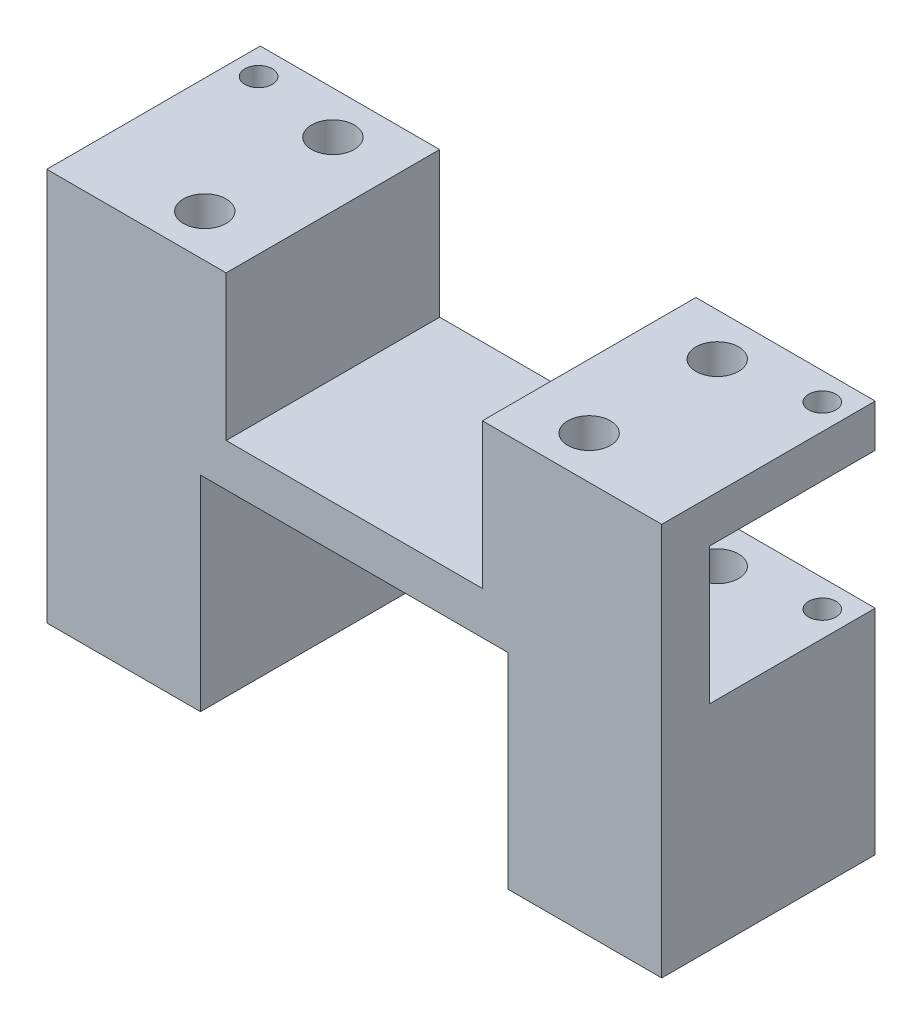
ISO-10303-21;
HEADER;
FILE_DESCRIPTION(('STEP AP214'),'2;1');
FILE_NAME('part.step','',(''),(''),'','','');
FILE_SCHEMA(('AUTOMOTIVE_DESIGN { 1 0 10303 214 1 1 1 1 }'));
ENDSEC;
DATA;
#1=APPLICATION_CONTEXT('core data for automotive mechanical design processes');
#2=APPLICATION_PROTOCOL_DEFINITION('international standard','automotive_design',2000,#1);
#3=PRODUCT_CONTEXT('',#1,'mechanical');
#4=PRODUCT('Part','Part','',(#3));
#5=PRODUCT_RELATED_PRODUCT_CATEGORY('part','',(#4));
#6=PRODUCT_DEFINITION_FORMATION('','',#4);
#7=PRODUCT_DEFINITION_CONTEXT('part definition',#1,'design');
#8=PRODUCT_DEFINITION('design','',#6,#7);
#9=PRODUCT_DEFINITION_SHAPE('','',#8);
#10=(LENGTH_UNIT() NAMED_UNIT(*) SI_UNIT(.MILLI.,.METRE.));
#11=(NAMED_UNIT(*) PLANE_ANGLE_UNIT() SI_UNIT($,.RADIAN.));
#12=(NAMED_UNIT(*) SI_UNIT($,.STERADIAN.) SOLID_ANGLE_UNIT());
#13=UNCERTAINTY_MEASURE_WITH_UNIT(LENGTH_MEASURE(1.E-05),#10,'distance_accuracy_value','');
#14=(GEOMETRIC_REPRESENTATION_CONTEXT(3) GLOBAL_UNCERTAINTY_ASSIGNED_CONTEXT((#13)) GLOBAL_UNIT_ASSIGNED_CONTEXT((#10,
#11,#12)) REPRESENTATION_CONTEXT('',''));
#15=CARTESIAN_POINT('',(0.,0.,0.));
#16=DIRECTION('',(0.,0.,1.));
#17=DIRECTION('',(1.,0.,0.));
#18=AXIS2_PLACEMENT_3D('',#15,#16,#17);
#19=CARTESIAN_POINT('',(22.4999999999999,46.,-7.5));
#20=DIRECTION('',(0.,1.,0.));
#21=DIRECTION('',(0.,0.,1.));
#22=AXIS2_PLACEMENT_3D('',#19,#20,#21);
#23=CYLINDRICAL_SURFACE('',#22,2.49999999999999);
#24=CARTESIAN_POINT('',(22.4999999999999,0.,-7.5));
#25=DIRECTION('',(0.,1.,0.));
#26=DIRECTION('',(0.,0.,1.));
#27=AXIS2_PLACEMENT_3D('',#24,#25,#26);
#28=CIRCLE('',#27,2.49999999999999);
#29=CARTESIAN_POINT('',(22.4999999999999,0.,-5.00000000000001));
#30=VERTEX_POINT('',#29);
#31=EDGE_CURVE('E289',#30,#30,#28,.T.);
#32=ORIENTED_EDGE('',*,*,#31,.F.);
#33=EDGE_LOOP('',(#32));
#34=FACE_BOUND('',#33,.T.);
#35=CARTESIAN_POINT('',(22.4999999999999,25.,-7.5));
#36=DIRECTION('',(0.,1.,0.));
#37=DIRECTION('',(0.,0.,1.));
#38=AXIS2_PLACEMENT_3D('',#35,#36,#37);
#39=CIRCLE('',#38,2.49999999999999);
#40=CARTESIAN_POINT('',(22.4999999999999,25.,-5.00000000000001));
#41=VERTEX_POINT('',#40);
#42=EDGE_CURVE('E347',#41,#41,#39,.F.);
#43=ORIENTED_EDGE('',*,*,#42,.F.);
#44=EDGE_LOOP('',(#43));
#45=FACE_BOUND('',#44,.T.);
#46=ADVANCED_FACE('F35',(#34,#45),#23,.F.);
#47=CARTESIAN_POINT('',(-22.5,46.,-7.49999999999999));
#48=DIRECTION('',(0.,1.,0.));
#49=DIRECTION('',(0.,0.,1.));
#50=AXIS2_PLACEMENT_3D('',#47,#48,#49);
#51=CYLINDRICAL_SURFACE('',#50,2.49999999999999);
#52=CARTESIAN_POINT('',(-22.5,0.,-7.49999999999999));
#53=DIRECTION('',(0.,1.,0.));
#54=DIRECTION('',(0.,0.,1.));
#55=AXIS2_PLACEMENT_3D('',#52,#53,#54);
#56=CIRCLE('',#55,2.49999999999999);
#57=CARTESIAN_POINT('',(-22.5,0.,-5.00000000000001));
#58=VERTEX_POINT('',#57);
#59=EDGE_CURVE('E283',#58,#58,#56,.T.);
#60=ORIENTED_EDGE('',*,*,#59,.F.);
#61=EDGE_LOOP('',(#60));
#62=FACE_BOUND('',#61,.T.);
#63=CARTESIAN_POINT('',(-22.5,25.,-7.49999999999999));
#64=DIRECTION('',(0.,1.,0.));
#65=DIRECTION('',(0.,0.,1.));
#66=AXIS2_PLACEMENT_3D('',#63,#64,#65);
#67=CIRCLE('',#66,2.49999999999999);
#68=CARTESIAN_POINT('',(-22.5,25.,-5.));
#69=VERTEX_POINT('',#68);
#70=EDGE_CURVE('E196',#69,#69,#67,.F.);
#71=ORIENTED_EDGE('',*,*,#70,.F.);
#72=EDGE_LOOP('',(#71));
#73=FACE_BOUND('',#72,.T.);
#74=ADVANCED_FACE('F374',(#62,#73),#51,.F.);
#75=CARTESIAN_POINT('',(0.,46.,0.));
#76=DIRECTION('',(0.,1.,0.));
#77=DIRECTION('',(0.,0.,1.));
#78=AXIS2_PLACEMENT_3D('',#75,#76,#77);
#79=PLANE('',#78);
#80=DIRECTION('',(0.,0.,1.));
#81=VECTOR('',#80,1.);
#82=CARTESIAN_POINT('',(-15.,46.,12.5));
#83=LINE('',#82,#81);
#84=CARTESIAN_POINT('',(-15.,46.,-12.5));
#85=VERTEX_POINT('',#84);
#86=CARTESIAN_POINT('',(-15.,46.,12.5));
#87=VERTEX_POINT('',#86);
#88=EDGE_CURVE('E216',#85,#87,#83,.T.);
#89=ORIENTED_EDGE('',*,*,#88,.F.);
#90=DIRECTION('',(-1.,0.,0.));
#91=VECTOR('',#90,1.);
#92=CARTESIAN_POINT('',(-36.,46.,-12.5));
#93=LINE('',#92,#91);
#94=CARTESIAN_POINT('',(-36.,46.,-12.5));
#95=VERTEX_POINT('',#94);
#96=EDGE_CURVE('E308',#85,#95,#93,.T.);
#97=ORIENTED_EDGE('',*,*,#96,.T.);
#98=DIRECTION('',(0.,0.,1.));
#99=VECTOR('',#98,1.);
#100=CARTESIAN_POINT('',(-36.,46.,-12.5));
#101=LINE('',#100,#99);
#102=CARTESIAN_POINT('',(-36.,46.,12.5));
#103=VERTEX_POINT('',#102);
#104=EDGE_CURVE('E313',#95,#103,#101,.T.);
#105=ORIENTED_EDGE('',*,*,#104,.T.);
#106=DIRECTION('',(1.,0.,0.));
#107=VECTOR('',#106,1.);
#108=CARTESIAN_POINT('',(-36.,46.,12.5));
#109=LINE('',#108,#107);
#110=EDGE_CURVE('E316',#103,#87,#109,.T.);
#111=ORIENTED_EDGE('',*,*,#110,.T.);
#112=EDGE_LOOP('',(#89,#97,#105,#111));
#113=FACE_BOUND('',#112,.T.);
#114=CARTESIAN_POINT('',(-33.,46.,-9.30000000000001));
#115=DIRECTION('',(0.,1.,0.));
#116=DIRECTION('',(0.,0.,1.));
#117=AXIS2_PLACEMENT_3D('',#114,#115,#116);
#118=CIRCLE('',#117,1.6);
#119=CARTESIAN_POINT('',(-33.,46.,-7.70000000000001));
#120=VERTEX_POINT('',#119);
#121=EDGE_CURVE('E296',#120,#120,#118,.T.);
#122=ORIENTED_EDGE('',*,*,#121,.F.);
#123=EDGE_LOOP('',(#122));
#124=FACE_BOUND('',#123,.T.);
#125=CARTESIAN_POINT('',(-22.5,46.,-7.49999999999999));
#126=DIRECTION('',(0.,1.,0.));
#127=DIRECTION('',(0.,0.,1.));
#128=AXIS2_PLACEMENT_3D('',#125,#126,#127);
#129=CIRCLE('',#128,2.5);
#130=CARTESIAN_POINT('',(-22.5,46.,-5.));
#131=VERTEX_POINT('',#130);
#132=EDGE_CURVE('E280',#131,#131,#129,.T.);
#133=ORIENTED_EDGE('',*,*,#132,.F.);
#134=EDGE_LOOP('',(#133));
#135=FACE_BOUND('',#134,.T.);
#136=CARTESIAN_POINT('',(-22.5,46.,7.50000000000001));
#137=DIRECTION('',(0.,1.,0.));
#138=DIRECTION('',(0.,0.,1.));
#139=AXIS2_PLACEMENT_3D('',#136,#137,#138);
#140=CIRCLE('',#139,2.5);
#141=CARTESIAN_POINT('',(-22.5,46.,10.));
#142=VERTEX_POINT('',#141);
#143=EDGE_CURVE('E262',#142,#142,#140,.T.);
#144=ORIENTED_EDGE('',*,*,#143,.F.);
#145=EDGE_LOOP('',(#144));
#146=FACE_BOUND('',#145,.T.);
#147=ADVANCED_FACE('F380',(#113,#124,#135,#146),#79,.T.);
#148=CARTESIAN_POINT('',(0.,0.,0.));
#149=DIRECTION('',(0.,1.,0.));
#150=DIRECTION('',(0.,0.,1.));
#151=AXIS2_PLACEMENT_3D('',#148,#149,#150);
#152=PLANE('',#151);
#153=ORIENTED_EDGE('',*,*,#31,.T.);
#154=EDGE_LOOP('',(#153));
#155=FACE_BOUND('',#154,.T.);
#156=CARTESIAN_POINT('',(22.5,0.,7.5));
#157=DIRECTION('',(0.,1.,0.));
#158=DIRECTION('',(0.,0.,1.));
#159=AXIS2_PLACEMENT_3D('',#156,#157,#158);
#160=CIRCLE('',#159,2.49999999999999);
#161=CARTESIAN_POINT('',(22.5,0.,9.99999999999999));
#162=VERTEX_POINT('',#161);
#163=EDGE_CURVE('E277',#162,#162,#160,.T.);
#164=ORIENTED_EDGE('',*,*,#163,.T.);
#165=EDGE_LOOP('',(#164));
#166=FACE_BOUND('',#165,.T.);
#167=DIRECTION('',(1.,0.,0.));
#168=VECTOR('',#167,1.);
#169=CARTESIAN_POINT('',(-36.,0.,12.5));
#170=LINE('',#169,#168);
#171=CARTESIAN_POINT('',(18.,0.,12.5));
#172=VERTEX_POINT('',#171);
#173=CARTESIAN_POINT('',(36.,0.,12.5));
#174=VERTEX_POINT('',#173);
#175=EDGE_CURVE('E327',#172,#174,#170,.T.);
#176=ORIENTED_EDGE('',*,*,#175,.F.);
#177=DIRECTION('',(0.,0.,1.));
#178=VECTOR('',#177,1.);
#179=CARTESIAN_POINT('',(18.,0.,-12.5));
#180=LINE('',#179,#178);
#181=CARTESIAN_POINT('',(18.,0.,-12.5));
#182=VERTEX_POINT('',#181);
#183=EDGE_CURVE('E263',#182,#172,#180,.T.);
#184=ORIENTED_EDGE('',*,*,#183,.F.);
#185=DIRECTION('',(-1.,0.,0.));
#186=VECTOR('',#185,1.);
#187=CARTESIAN_POINT('',(-36.,0.,-12.5));
#188=LINE('',#187,#186);
#189=CARTESIAN_POINT('',(36.,0.,-12.5));
#190=VERTEX_POINT('',#189);
#191=EDGE_CURVE('E322',#190,#182,#188,.T.);
#192=ORIENTED_EDGE('',*,*,#191,.F.);
#193=DIRECTION('',(0.,0.,-1.));
#194=VECTOR('',#193,1.);
#195=CARTESIAN_POINT('',(36.,0.,-12.5));
#196=LINE('',#195,#194);
#197=EDGE_CURVE('E302',#174,#190,#196,.T.);
#198=ORIENTED_EDGE('',*,*,#197,.F.);
#199=EDGE_LOOP('',(#176,#184,#192,#198));
#200=FACE_BOUND('',#199,.T.);
#201=ADVANCED_FACE('F412',(#155,#166,#200),#152,.F.);
#202=CARTESIAN_POINT('',(36.,46.,-12.5));
#203=DIRECTION('',(-1.,0.,0.));
#204=DIRECTION('',(0.,0.,1.));
#205=AXIS2_PLACEMENT_3D('',#202,#203,#204);
#206=PLANE('',#205);
#207=DIRECTION('',(0.,-1.,0.));
#208=VECTOR('',#207,1.);
#209=CARTESIAN_POINT('',(36.,41.,6.92498073958794));
#210=LINE('',#209,#208);
#211=CARTESIAN_POINT('',(36.,41.,6.92498073958794));
#212=VERTEX_POINT('',#211);
#213=CARTESIAN_POINT('',(36.,25.,6.92498073958794));
#214=VERTEX_POINT('',#213);
#215=EDGE_CURVE('E162',#212,#214,#210,.T.);
#216=ORIENTED_EDGE('',*,*,#215,.F.);
#217=DIRECTION('',(0.,0.,-1.));
#218=VECTOR('',#217,1.);
#219=CARTESIAN_POINT('',(36.,41.,-12.5));
#220=LINE('',#219,#218);
#221=CARTESIAN_POINT('',(36.,41.,-12.5));
#222=VERTEX_POINT('',#221);
#223=EDGE_CURVE('E171',#212,#222,#220,.T.);
#224=ORIENTED_EDGE('',*,*,#223,.T.);
#225=DIRECTION('',(0.,-1.,0.));
#226=VECTOR('',#225,1.);
#227=CARTESIAN_POINT('',(36.,46.,-12.5));
#228=LINE('',#227,#226);
#229=CARTESIAN_POINT('',(36.,46.,-12.5));
#230=VERTEX_POINT('',#229);
#231=EDGE_CURVE('E339',#230,#222,#228,.T.);
#232=ORIENTED_EDGE('',*,*,#231,.F.);
#233=DIRECTION('',(0.,0.,-1.));
#234=VECTOR('',#233,1.);
#235=CARTESIAN_POINT('',(36.,46.,-12.5));
#236=LINE('',#235,#234);
#237=CARTESIAN_POINT('',(36.,46.,12.5));
#238=VERTEX_POINT('',#237);
#239=EDGE_CURVE('E305',#238,#230,#236,.T.);
#240=ORIENTED_EDGE('',*,*,#239,.F.);
#241=DIRECTION('',(0.,-1.,0.));
#242=VECTOR('',#241,1.);
#243=CARTESIAN_POINT('',(36.,46.,12.5));
#244=LINE('',#243,#242);
#245=EDGE_CURVE('E319',#238,#174,#244,.T.);
#246=ORIENTED_EDGE('',*,*,#245,.T.);
#247=ORIENTED_EDGE('',*,*,#197,.T.);
#248=CARTESIAN_POINT('',(36.,25.,-12.5));
#249=VERTEX_POINT('',#248);
#250=EDGE_CURVE('E178',#249,#190,#228,.T.);
#251=ORIENTED_EDGE('',*,*,#250,.F.);
#252=DIRECTION('',(0.,0.,-1.));
#253=VECTOR('',#252,1.);
#254=CARTESIAN_POINT('',(36.,25.,-12.5));
#255=LINE('',#254,#253);
#256=EDGE_CURVE('E50',#214,#249,#255,.T.);
#257=ORIENTED_EDGE('',*,*,#256,.F.);
#258=EDGE_LOOP('',(#216,#224,#232,#240,#246,#247,#251,#257));
#259=FACE_BOUND('',#258,.T.);
#260=ADVANCED_FACE('F37',(#259),#206,.F.);
#261=CARTESIAN_POINT('',(-36.,46.,-12.5));
#262=DIRECTION('',(0.,0.,1.));
#263=DIRECTION('',(1.,0.,0.));
#264=AXIS2_PLACEMENT_3D('',#261,#262,#263);
#265=PLANE('',#264);
#266=ORIENTED_EDGE('',*,*,#231,.T.);
#267=DIRECTION('',(-1.,0.,0.));
#268=VECTOR('',#267,1.);
#269=CARTESIAN_POINT('',(-36.,41.,-12.5));
#270=LINE('',#269,#268);
#271=CARTESIAN_POINT('',(16.8132770456772,41.,-12.5));
#272=VERTEX_POINT('',#271);
#273=EDGE_CURVE('E189',#222,#272,#270,.T.);
#274=ORIENTED_EDGE('',*,*,#273,.T.);
#275=DIRECTION('',(0.,-1.,0.));
#276=VECTOR('',#275,1.);
#277=CARTESIAN_POINT('',(16.8132770456772,41.,-12.5));
#278=LINE('',#277,#276);
#279=CARTESIAN_POINT('',(16.8132770456772,25.,-12.5));
#280=VERTEX_POINT('',#279);
#281=EDGE_CURVE('E11',#280,#272,#278,.F.);
#282=ORIENTED_EDGE('',*,*,#281,.F.);
#283=DIRECTION('',(-1.,0.,0.));
#284=VECTOR('',#283,1.);
#285=CARTESIAN_POINT('',(-36.,25.,-12.5));
#286=LINE('',#285,#284);
#287=EDGE_CURVE('E174',#249,#280,#286,.T.);
#288=ORIENTED_EDGE('',*,*,#287,.F.);
#289=ORIENTED_EDGE('',*,*,#250,.T.);
#290=ORIENTED_EDGE('',*,*,#191,.T.);
#291=DIRECTION('',(0.,1.,0.));
#292=VECTOR('',#291,1.);
#293=CARTESIAN_POINT('',(18.,24.,-12.5));
#294=LINE('',#293,#292);
#295=CARTESIAN_POINT('',(18.,24.,-12.5));
#296=VERTEX_POINT('',#295);
#297=EDGE_CURVE('E250',#182,#296,#294,.T.);
#298=ORIENTED_EDGE('',*,*,#297,.T.);
#299=DIRECTION('',(-1.,0.,0.));
#300=VECTOR('',#299,1.);
#301=CARTESIAN_POINT('',(-18.,24.,-12.5));
#302=LINE('',#301,#300);
#303=CARTESIAN_POINT('',(-18.,24.,-12.5));
#304=VERTEX_POINT('',#303);
#305=EDGE_CURVE('E243',#296,#304,#302,.T.);
#306=ORIENTED_EDGE('',*,*,#305,.T.);
#307=DIRECTION('',(0.,-1.,0.));
#308=VECTOR('',#307,1.);
#309=CARTESIAN_POINT('',(-18.,24.,-12.5));
#310=LINE('',#309,#308);
#311=CARTESIAN_POINT('',(-18.,0.,-12.5));
#312=VERTEX_POINT('',#311);
#313=EDGE_CURVE('E246',#304,#312,#310,.T.);
#314=ORIENTED_EDGE('',*,*,#313,.T.);
#315=CARTESIAN_POINT('',(-36.,0.,-12.5));
#316=VERTEX_POINT('',#315);
#317=EDGE_CURVE('E321',#312,#316,#188,.T.);
#318=ORIENTED_EDGE('',*,*,#317,.T.);
#319=DIRECTION('',(0.,-1.,0.));
#320=VECTOR('',#319,1.);
#321=CARTESIAN_POINT('',(-36.,46.,-12.5));
#322=LINE('',#321,#320);
#323=CARTESIAN_POINT('',(-36.,25.,-12.5));
#324=VERTEX_POINT('',#323);
#325=EDGE_CURVE('E335',#324,#316,#322,.T.);
#326=ORIENTED_EDGE('',*,*,#325,.F.);
#327=DIRECTION('',(-1.,0.,0.));
#328=VECTOR('',#327,1.);
#329=CARTESIAN_POINT('',(-36.,25.,-12.5));
#330=LINE('',#329,#328);
#331=CARTESIAN_POINT('',(-16.8132770456772,25.,-12.5));
#332=VERTEX_POINT('',#331);
#333=EDGE_CURVE('E58',#332,#324,#330,.T.);
#334=ORIENTED_EDGE('',*,*,#333,.F.);
#335=DIRECTION('',(0.,-1.,0.));
#336=VECTOR('',#335,1.);
#337=CARTESIAN_POINT('',(-16.8132770456772,41.,-12.5));
#338=LINE('',#337,#336);
#339=CARTESIAN_POINT('',(-16.8132770456772,41.,-12.5));
#340=VERTEX_POINT('',#339);
#341=EDGE_CURVE('E214',#340,#332,#338,.T.);
#342=ORIENTED_EDGE('',*,*,#341,.F.);
#343=DIRECTION('',(-1.,0.,0.));
#344=VECTOR('',#343,1.);
#345=CARTESIAN_POINT('',(-36.,41.,-12.5));
#346=LINE('',#345,#344);
#347=CARTESIAN_POINT('',(-36.,41.,-12.5));
#348=VERTEX_POINT('',#347);
#349=EDGE_CURVE('E211',#340,#348,#346,.T.);
#350=ORIENTED_EDGE('',*,*,#349,.T.);
#351=EDGE_CURVE('E336',#95,#348,#322,.T.);
#352=ORIENTED_EDGE('',*,*,#351,.F.);
#353=ORIENTED_EDGE('',*,*,#96,.F.);
#354=DIRECTION('',(0.,1.,0.));
#355=VECTOR('',#354,1.);
#356=CARTESIAN_POINT('',(-15.,29.,-12.5));
#357=LINE('',#356,#355);
#358=CARTESIAN_POINT('',(-15.,29.,-12.5));
#359=VERTEX_POINT('',#358);
#360=EDGE_CURVE('E233',#359,#85,#357,.T.);
#361=ORIENTED_EDGE('',*,*,#360,.F.);
#362=DIRECTION('',(-1.,0.,0.));
#363=VECTOR('',#362,1.);
#364=CARTESIAN_POINT('',(15.,29.,-12.5));
#365=LINE('',#364,#363);
#366=CARTESIAN_POINT('',(15.,29.,-12.5));
#367=VERTEX_POINT('',#366);
#368=EDGE_CURVE('E227',#367,#359,#365,.T.);
#369=ORIENTED_EDGE('',*,*,#368,.F.);
#370=DIRECTION('',(0.,1.,0.));
#371=VECTOR('',#370,1.);
#372=CARTESIAN_POINT('',(15.,29.,-12.5));
#373=LINE('',#372,#371);
#374=CARTESIAN_POINT('',(15.,46.,-12.5));
#375=VERTEX_POINT('',#374);
#376=EDGE_CURVE('E236',#367,#375,#373,.T.);
#377=ORIENTED_EDGE('',*,*,#376,.T.);
#378=EDGE_CURVE('E310',#230,#375,#93,.T.);
#379=ORIENTED_EDGE('',*,*,#378,.F.);
#380=EDGE_LOOP('',(#266,#274,#282,#288,#289,#290,#298,#306,#314,#318,#326,#334,#342,#350,#352,
#353,#361,#369,#377,#379));
#381=FACE_BOUND('',#380,.T.);
#382=ADVANCED_FACE('F496',(#381),#265,.F.);
#383=CARTESIAN_POINT('',(-36.,46.,-12.5));
#384=DIRECTION('',(1.,0.,0.));
#385=DIRECTION('',(0.,0.,-1.));
#386=AXIS2_PLACEMENT_3D('',#383,#384,#385);
#387=PLANE('',#386);
#388=ORIENTED_EDGE('',*,*,#351,.T.);
#389=DIRECTION('',(0.,0.,1.));
#390=VECTOR('',#389,1.);
#391=CARTESIAN_POINT('',(-36.,41.,-12.5));
#392=LINE('',#391,#390);
#393=CARTESIAN_POINT('',(-36.,41.,6.92498073958794));
#394=VERTEX_POINT('',#393);
#395=EDGE_CURVE('E208',#348,#394,#392,.T.);
#396=ORIENTED_EDGE('',*,*,#395,.T.);
#397=DIRECTION('',(0.,-1.,0.));
#398=VECTOR('',#397,1.);
#399=CARTESIAN_POINT('',(-36.,41.,6.92498073958794));
#400=LINE('',#399,#398);
#401=CARTESIAN_POINT('',(-36.,25.,6.92498073958794));
#402=VERTEX_POINT('',#401);
#403=EDGE_CURVE('E43',#402,#394,#400,.F.);
#404=ORIENTED_EDGE('',*,*,#403,.F.);
#405=DIRECTION('',(0.,0.,1.));
#406=VECTOR('',#405,1.);
#407=CARTESIAN_POINT('',(-36.,25.,-12.5));
#408=LINE('',#407,#406);
#409=EDGE_CURVE('E201',#324,#402,#408,.T.);
#410=ORIENTED_EDGE('',*,*,#409,.F.);
#411=ORIENTED_EDGE('',*,*,#325,.T.);
#412=DIRECTION('',(0.,0.,1.));
#413=VECTOR('',#412,1.);
#414=CARTESIAN_POINT('',(-36.,0.,-12.5));
#415=LINE('',#414,#413);
#416=CARTESIAN_POINT('',(-36.,0.,12.5));
#417=VERTEX_POINT('',#416);
#418=EDGE_CURVE('E325',#316,#417,#415,.T.);
#419=ORIENTED_EDGE('',*,*,#418,.T.);
#420=DIRECTION('',(0.,-1.,0.));
#421=VECTOR('',#420,1.);
#422=CARTESIAN_POINT('',(-36.,46.,12.5));
#423=LINE('',#422,#421);
#424=EDGE_CURVE('E332',#103,#417,#423,.T.);
#425=ORIENTED_EDGE('',*,*,#424,.F.);
#426=ORIENTED_EDGE('',*,*,#104,.F.);
#427=EDGE_LOOP('',(#388,#396,#404,#410,#411,#419,#425,#426));
#428=FACE_BOUND('',#427,.T.);
#429=ADVANCED_FACE('F413',(#428),#387,.F.);
#430=CARTESIAN_POINT('',(-36.,46.,12.5));
#431=DIRECTION('',(0.,0.,-1.));
#432=DIRECTION('',(-1.,0.,0.));
#433=AXIS2_PLACEMENT_3D('',#430,#431,#432);
#434=PLANE('',#433);
#435=DIRECTION('',(1.,0.,0.));
#436=VECTOR('',#435,1.);
#437=CARTESIAN_POINT('',(15.,29.,12.5));
#438=LINE('',#437,#436);
#439=CARTESIAN_POINT('',(-15.,29.,12.5));
#440=VERTEX_POINT('',#439);
#441=CARTESIAN_POINT('',(15.,29.,12.5));
#442=VERTEX_POINT('',#441);
#443=EDGE_CURVE('E220',#440,#442,#438,.T.);
#444=ORIENTED_EDGE('',*,*,#443,.F.);
#445=DIRECTION('',(0.,1.,0.));
#446=VECTOR('',#445,1.);
#447=CARTESIAN_POINT('',(-15.,29.,12.5));
#448=LINE('',#447,#446);
#449=EDGE_CURVE('E230',#440,#87,#448,.T.);
#450=ORIENTED_EDGE('',*,*,#449,.T.);
#451=ORIENTED_EDGE('',*,*,#110,.F.);
#452=ORIENTED_EDGE('',*,*,#424,.T.);
#453=CARTESIAN_POINT('',(-18.,0.,12.5));
#454=VERTEX_POINT('',#453);
#455=EDGE_CURVE('E309',#417,#454,#170,.T.);
#456=ORIENTED_EDGE('',*,*,#455,.T.);
#457=DIRECTION('',(0.,-1.,0.));
#458=VECTOR('',#457,1.);
#459=CARTESIAN_POINT('',(-18.,24.,12.5));
#460=LINE('',#459,#458);
#461=CARTESIAN_POINT('',(-18.,24.,12.5));
#462=VERTEX_POINT('',#461);
#463=EDGE_CURVE('E256',#462,#454,#460,.T.);
#464=ORIENTED_EDGE('',*,*,#463,.F.);
#465=DIRECTION('',(-1.,0.,0.));
#466=VECTOR('',#465,1.);
#467=CARTESIAN_POINT('',(-18.,24.,12.5));
#468=LINE('',#467,#466);
#469=CARTESIAN_POINT('',(18.,24.,12.5));
#470=VERTEX_POINT('',#469);
#471=EDGE_CURVE('E235',#470,#462,#468,.T.);
#472=ORIENTED_EDGE('',*,*,#471,.F.);
#473=DIRECTION('',(0.,1.,0.));
#474=VECTOR('',#473,1.);
#475=CARTESIAN_POINT('',(18.,24.,12.5));
#476=LINE('',#475,#474);
#477=EDGE_CURVE('E247',#172,#470,#476,.T.);
#478=ORIENTED_EDGE('',*,*,#477,.F.);
#479=ORIENTED_EDGE('',*,*,#175,.T.);
#480=ORIENTED_EDGE('',*,*,#245,.F.);
#481=CARTESIAN_POINT('',(15.,46.,12.5));
#482=VERTEX_POINT('',#481);
#483=EDGE_CURVE('E315',#482,#238,#109,.T.);
#484=ORIENTED_EDGE('',*,*,#483,.F.);
#485=DIRECTION('',(0.,1.,0.));
#486=VECTOR('',#485,1.);
#487=CARTESIAN_POINT('',(15.,29.,12.5));
#488=LINE('',#487,#486);
#489=EDGE_CURVE('E239',#442,#482,#488,.T.);
#490=ORIENTED_EDGE('',*,*,#489,.F.);
#491=EDGE_LOOP('',(#444,#450,#451,#452,#456,#464,#472,#478,#479,#480,#484,#490));
#492=FACE_BOUND('',#491,.T.);
#493=ADVANCED_FACE('F401',(#492),#434,.F.);
#494=DIRECTION('',(0.,0.,-1.));
#495=VECTOR('',#494,1.);
#496=CARTESIAN_POINT('',(15.,46.,12.5));
#497=LINE('',#496,#495);
#498=EDGE_CURVE('E221',#482,#375,#497,.T.);
#499=ORIENTED_EDGE('',*,*,#498,.F.);
#500=ORIENTED_EDGE('',*,*,#483,.T.);
#501=ORIENTED_EDGE('',*,*,#239,.T.);
#502=ORIENTED_EDGE('',*,*,#378,.T.);
#503=EDGE_LOOP('',(#499,#500,#501,#502));
#504=FACE_BOUND('',#503,.T.);
#505=CARTESIAN_POINT('',(22.5,46.,7.5));
#506=DIRECTION('',(0.,1.,0.));
#507=DIRECTION('',(0.,0.,1.));
#508=AXIS2_PLACEMENT_3D('',#505,#506,#507);
#509=CIRCLE('',#508,2.5);
#510=CARTESIAN_POINT('',(22.5,46.,9.99999999999999));
#511=VERTEX_POINT('',#510);
#512=EDGE_CURVE('E274',#511,#511,#509,.T.);
#513=ORIENTED_EDGE('',*,*,#512,.F.);
#514=EDGE_LOOP('',(#513));
#515=FACE_BOUND('',#514,.T.);
#516=CARTESIAN_POINT('',(22.4999999999999,46.,-7.5));
#517=DIRECTION('',(0.,1.,0.));
#518=DIRECTION('',(0.,0.,1.));
#519=AXIS2_PLACEMENT_3D('',#516,#517,#518);
#520=CIRCLE('',#519,2.5);
#521=CARTESIAN_POINT('',(22.4999999999999,46.,-5.));
#522=VERTEX_POINT('',#521);
#523=EDGE_CURVE('E286',#522,#522,#520,.T.);
#524=ORIENTED_EDGE('',*,*,#523,.F.);
#525=EDGE_LOOP('',(#524));
#526=FACE_BOUND('',#525,.T.);
#527=CARTESIAN_POINT('',(33.,46.,-9.30000000000001));
#528=DIRECTION('',(0.,1.,0.));
#529=DIRECTION('',(0.,0.,-1.));
#530=AXIS2_PLACEMENT_3D('',#527,#528,#529);
#531=CIRCLE('',#530,1.6);
#532=CARTESIAN_POINT('',(33.,46.,-10.9));
#533=VERTEX_POINT('',#532);
#534=EDGE_CURVE('E292',#533,#533,#531,.T.);
#535=ORIENTED_EDGE('',*,*,#534,.F.);
#536=EDGE_LOOP('',(#535));
#537=FACE_BOUND('',#536,.T.);
#538=ADVANCED_FACE('F397',(#504,#515,#526,#537),#79,.T.);
#539=CARTESIAN_POINT('',(-22.5,0.,7.50000000000001));
#540=DIRECTION('',(0.,1.,0.));
#541=DIRECTION('',(0.,0.,1.));
#542=AXIS2_PLACEMENT_3D('',#539,#540,#541);
#543=CIRCLE('',#542,2.49999999999999);
#544=CARTESIAN_POINT('',(-22.5,0.,9.99999999999999));
#545=VERTEX_POINT('',#544);
#546=EDGE_CURVE('E271',#545,#545,#543,.T.);
#547=ORIENTED_EDGE('',*,*,#546,.T.);
#548=EDGE_LOOP('',(#547));
#549=FACE_BOUND('',#548,.T.);
#550=ORIENTED_EDGE('',*,*,#59,.T.);
#551=EDGE_LOOP('',(#550));
#552=FACE_BOUND('',#551,.T.);
#553=ORIENTED_EDGE('',*,*,#317,.F.);
#554=DIRECTION('',(0.,0.,1.));
#555=VECTOR('',#554,1.);
#556=CARTESIAN_POINT('',(-18.,0.,-12.5));
#557=LINE('',#556,#555);
#558=EDGE_CURVE('E265',#312,#454,#557,.T.);
#559=ORIENTED_EDGE('',*,*,#558,.T.);
#560=ORIENTED_EDGE('',*,*,#455,.F.);
#561=ORIENTED_EDGE('',*,*,#418,.F.);
#562=EDGE_LOOP('',(#553,#559,#560,#561));
#563=FACE_BOUND('',#562,.T.);
#564=ADVANCED_FACE('F400',(#549,#552,#563),#152,.F.);
#565=CARTESIAN_POINT('',(-33.,11.,-9.30000000000001));
#566=DIRECTION('',(0.,1.,0.));
#567=DIRECTION('',(0.,0.,1.));
#568=AXIS2_PLACEMENT_3D('',#565,#566,#567);
#569=CYLINDRICAL_SURFACE('',#568,1.6);
#570=CARTESIAN_POINT('',(-33.,41.,-9.30000000000001));
#571=DIRECTION('',(0.,1.,0.));
#572=DIRECTION('',(0.,0.,1.));
#573=AXIS2_PLACEMENT_3D('',#570,#571,#572);
#574=CIRCLE('',#573,1.6);
#575=CARTESIAN_POINT('',(-33.,41.,-7.70000000000001));
#576=VERTEX_POINT('',#575);
#577=EDGE_CURVE('E205',#576,#576,#574,.F.);
#578=ORIENTED_EDGE('',*,*,#577,.T.);
#579=EDGE_LOOP('',(#578));
#580=FACE_BOUND('',#579,.T.);
#581=ORIENTED_EDGE('',*,*,#121,.T.);
#582=EDGE_LOOP('',(#581));
#583=FACE_BOUND('',#582,.T.);
#584=ADVANCED_FACE('F371',(#580,#583),#569,.F.);
#585=CARTESIAN_POINT('',(33.,11.,-9.30000000000001));
#586=DIRECTION('',(0.,1.,0.));
#587=DIRECTION('',(0.,0.,1.));
#588=AXIS2_PLACEMENT_3D('',#585,#586,#587);
#589=CYLINDRICAL_SURFACE('',#588,1.6);
#590=CARTESIAN_POINT('',(33.,41.,-9.30000000000001));
#591=DIRECTION('',(0.,1.,0.));
#592=DIRECTION('',(0.,0.,1.));
#593=AXIS2_PLACEMENT_3D('',#590,#591,#592);
#594=CIRCLE('',#593,1.6);
#595=CARTESIAN_POINT('',(33.,41.,-7.70000000000001));
#596=VERTEX_POINT('',#595);
#597=EDGE_CURVE('E182',#596,#596,#594,.F.);
#598=ORIENTED_EDGE('',*,*,#597,.T.);
#599=EDGE_LOOP('',(#598));
#600=FACE_BOUND('',#599,.T.);
#601=ORIENTED_EDGE('',*,*,#534,.T.);
#602=EDGE_LOOP('',(#601));
#603=FACE_BOUND('',#602,.T.);
#604=ADVANCED_FACE('F361',(#600,#603),#589,.F.);
#605=CARTESIAN_POINT('',(22.4999999999999,41.,-7.5));
#606=DIRECTION('',(0.,1.,0.));
#607=DIRECTION('',(0.,0.,1.));
#608=AXIS2_PLACEMENT_3D('',#605,#606,#607);
#609=CIRCLE('',#608,2.49999999999999);
#610=CARTESIAN_POINT('',(22.4999999999999,41.,-5.00000000000001));
#611=VERTEX_POINT('',#610);
#612=EDGE_CURVE('E179',#611,#611,#609,.F.);
#613=ORIENTED_EDGE('',*,*,#612,.T.);
#614=EDGE_LOOP('',(#613));
#615=FACE_BOUND('',#614,.T.);
#616=ORIENTED_EDGE('',*,*,#523,.T.);
#617=EDGE_LOOP('',(#616));
#618=FACE_BOUND('',#617,.T.);
#619=ADVANCED_FACE('F370',(#615,#618),#23,.F.);
#620=CARTESIAN_POINT('',(-22.5,41.,-7.49999999999999));
#621=DIRECTION('',(0.,1.,0.));
#622=DIRECTION('',(0.,0.,1.));
#623=AXIS2_PLACEMENT_3D('',#620,#621,#622);
#624=CIRCLE('',#623,2.49999999999999);
#625=CARTESIAN_POINT('',(-22.5,41.,-5.));
#626=VERTEX_POINT('',#625);
#627=EDGE_CURVE('E204',#626,#626,#624,.F.);
#628=ORIENTED_EDGE('',*,*,#627,.T.);
#629=EDGE_LOOP('',(#628));
#630=FACE_BOUND('',#629,.T.);
#631=ORIENTED_EDGE('',*,*,#132,.T.);
#632=EDGE_LOOP('',(#631));
#633=FACE_BOUND('',#632,.T.);
#634=ADVANCED_FACE('F383',(#630,#633),#51,.F.);
#635=CARTESIAN_POINT('',(22.5,46.,7.5));
#636=DIRECTION('',(0.,1.,0.));
#637=DIRECTION('',(0.,0.,1.));
#638=AXIS2_PLACEMENT_3D('',#635,#636,#637);
#639=CYLINDRICAL_SURFACE('',#638,2.49999999999999);
#640=ORIENTED_EDGE('',*,*,#163,.F.);
#641=EDGE_LOOP('',(#640));
#642=FACE_BOUND('',#641,.T.);
#643=ORIENTED_EDGE('',*,*,#512,.T.);
#644=EDGE_LOOP('',(#643));
#645=FACE_BOUND('',#644,.T.);
#646=ADVANCED_FACE('F391',(#642,#645),#639,.F.);
#647=CARTESIAN_POINT('',(-22.5,46.,7.50000000000001));
#648=DIRECTION('',(0.,1.,0.));
#649=DIRECTION('',(0.,0.,1.));
#650=AXIS2_PLACEMENT_3D('',#647,#648,#649);
#651=CYLINDRICAL_SURFACE('',#650,2.49999999999999);
#652=ORIENTED_EDGE('',*,*,#546,.F.);
#653=EDGE_LOOP('',(#652));
#654=FACE_BOUND('',#653,.T.);
#655=ORIENTED_EDGE('',*,*,#143,.T.);
#656=EDGE_LOOP('',(#655));
#657=FACE_BOUND('',#656,.T.);
#658=ADVANCED_FACE('F434',(#654,#657),#651,.F.);
#659=CARTESIAN_POINT('',(-18.,24.,-12.5));
#660=DIRECTION('',(0.,1.,0.));
#661=DIRECTION('',(-1.,0.,0.));
#662=AXIS2_PLACEMENT_3D('',#659,#660,#661);
#663=PLANE('',#662);
#664=ORIENTED_EDGE('',*,*,#471,.T.);
#665=DIRECTION('',(0.,0.,1.));
#666=VECTOR('',#665,1.);
#667=CARTESIAN_POINT('',(-18.,24.,-12.5));
#668=LINE('',#667,#666);
#669=EDGE_CURVE('E253',#304,#462,#668,.T.);
#670=ORIENTED_EDGE('',*,*,#669,.F.);
#671=ORIENTED_EDGE('',*,*,#305,.F.);
#672=DIRECTION('',(0.,0.,1.));
#673=VECTOR('',#672,1.);
#674=CARTESIAN_POINT('',(18.,24.,-12.5));
#675=LINE('',#674,#673);
#676=EDGE_CURVE('E260',#296,#470,#675,.T.);
#677=ORIENTED_EDGE('',*,*,#676,.T.);
#678=EDGE_LOOP('',(#664,#670,#671,#677));
#679=FACE_BOUND('',#678,.T.);
#680=ADVANCED_FACE('F436',(#679),#663,.F.);
#681=CARTESIAN_POINT('',(18.,24.,-12.5));
#682=DIRECTION('',(1.,0.,0.));
#683=DIRECTION('',(0.,0.,-1.));
#684=AXIS2_PLACEMENT_3D('',#681,#682,#683);
#685=PLANE('',#684);
#686=ORIENTED_EDGE('',*,*,#477,.T.);
#687=ORIENTED_EDGE('',*,*,#676,.F.);
#688=ORIENTED_EDGE('',*,*,#297,.F.);
#689=ORIENTED_EDGE('',*,*,#183,.T.);
#690=EDGE_LOOP('',(#686,#687,#688,#689));
#691=FACE_BOUND('',#690,.T.);
#692=ADVANCED_FACE('F443',(#691),#685,.F.);
#693=CARTESIAN_POINT('',(-18.,24.,-12.5));
#694=DIRECTION('',(-1.,0.,0.));
#695=DIRECTION('',(0.,0.,1.));
#696=AXIS2_PLACEMENT_3D('',#693,#694,#695);
#697=PLANE('',#696);
#698=ORIENTED_EDGE('',*,*,#463,.T.);
#699=ORIENTED_EDGE('',*,*,#558,.F.);
#700=ORIENTED_EDGE('',*,*,#313,.F.);
#701=ORIENTED_EDGE('',*,*,#669,.T.);
#702=EDGE_LOOP('',(#698,#699,#700,#701));
#703=FACE_BOUND('',#702,.T.);
#704=ADVANCED_FACE('F450',(#703),#697,.F.);
#705=CARTESIAN_POINT('',(-15.,29.,12.5));
#706=DIRECTION('',(-1.,0.,0.));
#707=DIRECTION('',(0.,0.,1.));
#708=AXIS2_PLACEMENT_3D('',#705,#706,#707);
#709=PLANE('',#708);
#710=ORIENTED_EDGE('',*,*,#88,.T.);
#711=ORIENTED_EDGE('',*,*,#449,.F.);
#712=DIRECTION('',(0.,0.,1.));
#713=VECTOR('',#712,1.);
#714=CARTESIAN_POINT('',(-15.,29.,12.5));
#715=LINE('',#714,#713);
#716=EDGE_CURVE('E217',#359,#440,#715,.T.);
#717=ORIENTED_EDGE('',*,*,#716,.F.);
#718=ORIENTED_EDGE('',*,*,#360,.T.);
#719=EDGE_LOOP('',(#710,#711,#717,#718));
#720=FACE_BOUND('',#719,.T.);
#721=ADVANCED_FACE('F453',(#720),#709,.F.);
#722=CARTESIAN_POINT('',(15.,29.,12.5));
#723=DIRECTION('',(1.,0.,0.));
#724=DIRECTION('',(0.,0.,-1.));
#725=AXIS2_PLACEMENT_3D('',#722,#723,#724);
#726=PLANE('',#725);
#727=ORIENTED_EDGE('',*,*,#498,.T.);
#728=ORIENTED_EDGE('',*,*,#376,.F.);
#729=DIRECTION('',(0.,0.,-1.));
#730=VECTOR('',#729,1.);
#731=CARTESIAN_POINT('',(15.,29.,12.5));
#732=LINE('',#731,#730);
#733=EDGE_CURVE('E224',#442,#367,#732,.T.);
#734=ORIENTED_EDGE('',*,*,#733,.F.);
#735=ORIENTED_EDGE('',*,*,#489,.T.);
#736=EDGE_LOOP('',(#727,#728,#734,#735));
#737=FACE_BOUND('',#736,.T.);
#738=ADVANCED_FACE('F460',(#737),#726,.F.);
#739=CARTESIAN_POINT('',(0.,29.,0.));
#740=DIRECTION('',(0.,1.,0.));
#741=DIRECTION('',(0.,0.,1.));
#742=AXIS2_PLACEMENT_3D('',#739,#740,#741);
#743=PLANE('',#742);
#744=ORIENTED_EDGE('',*,*,#716,.T.);
#745=ORIENTED_EDGE('',*,*,#443,.T.);
#746=ORIENTED_EDGE('',*,*,#733,.T.);
#747=ORIENTED_EDGE('',*,*,#368,.T.);
#748=EDGE_LOOP('',(#744,#745,#746,#747));
#749=FACE_BOUND('',#748,.T.);
#750=ADVANCED_FACE('F464',(#749),#743,.T.);
#751=CARTESIAN_POINT('',(-33.,41.,-9.30000000000001));
#752=DIRECTION('',(0.,-1.,0.));
#753=DIRECTION('',(0.,0.,-1.));
#754=AXIS2_PLACEMENT_3D('',#751,#752,#753);
#755=CYLINDRICAL_SURFACE('',#754,16.5);
#756=ORIENTED_EDGE('',*,*,#341,.T.);
#757=CARTESIAN_POINT('',(-33.,25.,-9.30000000000001));
#758=DIRECTION('',(0.,1.,0.));
#759=DIRECTION('',(0.,0.,1.));
#760=AXIS2_PLACEMENT_3D('',#757,#758,#759);
#761=CIRCLE('',#760,16.5);
#762=EDGE_CURVE('E170',#402,#332,#761,.T.);
#763=ORIENTED_EDGE('',*,*,#762,.F.);
#764=ORIENTED_EDGE('',*,*,#403,.T.);
#765=CARTESIAN_POINT('',(-33.,41.,-9.30000000000001));
#766=DIRECTION('',(0.,1.,0.));
#767=DIRECTION('',(0.,0.,1.));
#768=AXIS2_PLACEMENT_3D('',#765,#766,#767);
#769=CIRCLE('',#768,16.5);
#770=EDGE_CURVE('E193',#394,#340,#769,.T.);
#771=ORIENTED_EDGE('',*,*,#770,.T.);
#772=EDGE_LOOP('',(#756,#763,#764,#771));
#773=FACE_BOUND('',#772,.T.);
#774=ADVANCED_FACE('F468',(#773),#755,.F.);
#775=CARTESIAN_POINT('',(-33.,41.,-9.30000000000001));
#776=DIRECTION('',(0.,1.,0.));
#777=DIRECTION('',(0.,0.,1.));
#778=AXIS2_PLACEMENT_3D('',#775,#776,#777);
#779=PLANE('',#778);
#780=ORIENTED_EDGE('',*,*,#627,.F.);
#781=EDGE_LOOP('',(#780));
#782=FACE_BOUND('',#781,.T.);
#783=ORIENTED_EDGE('',*,*,#577,.F.);
#784=EDGE_LOOP('',(#783));
#785=FACE_BOUND('',#784,.T.);
#786=ORIENTED_EDGE('',*,*,#770,.F.);
#787=ORIENTED_EDGE('',*,*,#395,.F.);
#788=ORIENTED_EDGE('',*,*,#349,.F.);
#789=EDGE_LOOP('',(#786,#787,#788));
#790=FACE_BOUND('',#789,.T.);
#791=ADVANCED_FACE('F472',(#782,#785,#790),#779,.F.);
#792=CARTESIAN_POINT('',(-33.,25.,-9.30000000000001));
#793=DIRECTION('',(0.,1.,0.));
#794=DIRECTION('',(0.,0.,1.));
#795=AXIS2_PLACEMENT_3D('',#792,#793,#794);
#796=PLANE('',#795);
#797=CARTESIAN_POINT('',(-33.,25.,-9.30000000000001));
#798=DIRECTION('',(0.,1.,0.));
#799=DIRECTION('',(0.,0.,1.));
#800=AXIS2_PLACEMENT_3D('',#797,#798,#799);
#801=CIRCLE('',#800,1.6);
#802=CARTESIAN_POINT('',(-33.,25.,-7.70000000000001));
#803=VERTEX_POINT('',#802);
#804=EDGE_CURVE('E198',#803,#803,#801,.F.);
#805=ORIENTED_EDGE('',*,*,#804,.T.);
#806=EDGE_LOOP('',(#805));
#807=FACE_BOUND('',#806,.T.);
#808=ORIENTED_EDGE('',*,*,#70,.T.);
#809=EDGE_LOOP('',(#808));
#810=FACE_BOUND('',#809,.T.);
#811=ORIENTED_EDGE('',*,*,#333,.T.);
#812=ORIENTED_EDGE('',*,*,#409,.T.);
#813=ORIENTED_EDGE('',*,*,#762,.T.);
#814=EDGE_LOOP('',(#811,#812,#813));
#815=FACE_BOUND('',#814,.T.);
#816=ADVANCED_FACE('F474',(#807,#810,#815),#796,.T.);
#817=CARTESIAN_POINT('',(-33.,11.,-9.30000000000001));
#818=DIRECTION('',(0.,1.,0.));
#819=DIRECTION('',(0.,0.,1.));
#820=AXIS2_PLACEMENT_3D('',#817,#818,#819);
#821=PLANE('',#820);
#822=CARTESIAN_POINT('',(-33.,11.,-9.30000000000001));
#823=DIRECTION('',(0.,1.,0.));
#824=DIRECTION('',(0.,0.,1.));
#825=AXIS2_PLACEMENT_3D('',#822,#823,#824);
#826=CIRCLE('',#825,1.6);
#827=CARTESIAN_POINT('',(-33.,11.,-7.70000000000001));
#828=VERTEX_POINT('',#827);
#829=EDGE_CURVE('E299',#828,#828,#826,.T.);
#830=ORIENTED_EDGE('',*,*,#829,.T.);
#831=EDGE_LOOP('',(#830));
#832=FACE_BOUND('',#831,.T.);
#833=ADVANCED_FACE('F477',(#832),#821,.T.);
#834=ORIENTED_EDGE('',*,*,#829,.F.);
#835=EDGE_LOOP('',(#834));
#836=FACE_BOUND('',#835,.T.);
#837=ORIENTED_EDGE('',*,*,#804,.F.);
#838=EDGE_LOOP('',(#837));
#839=FACE_BOUND('',#838,.T.);
#840=ADVANCED_FACE('F485',(#836,#839),#569,.F.);
#841=CARTESIAN_POINT('',(33.,41.,-9.30000000000001));
#842=DIRECTION('',(0.,-1.,0.));
#843=DIRECTION('',(0.,0.,-1.));
#844=AXIS2_PLACEMENT_3D('',#841,#842,#843);
#845=CYLINDRICAL_SURFACE('',#844,16.5);
#846=ORIENTED_EDGE('',*,*,#215,.T.);
#847=CARTESIAN_POINT('',(33.,25.,-9.30000000000001));
#848=DIRECTION('',(0.,1.,0.));
#849=DIRECTION('',(0.,0.,1.));
#850=AXIS2_PLACEMENT_3D('',#847,#848,#849);
#851=CIRCLE('',#850,16.5);
#852=EDGE_CURVE('E164',#280,#214,#851,.T.);
#853=ORIENTED_EDGE('',*,*,#852,.F.);
#854=ORIENTED_EDGE('',*,*,#281,.T.);
#855=CARTESIAN_POINT('',(33.,41.,-9.30000000000001));
#856=DIRECTION('',(0.,1.,0.));
#857=DIRECTION('',(0.,0.,1.));
#858=AXIS2_PLACEMENT_3D('',#855,#856,#857);
#859=CIRCLE('',#858,16.5);
#860=EDGE_CURVE('E167',#272,#212,#859,.T.);
#861=ORIENTED_EDGE('',*,*,#860,.T.);
#862=EDGE_LOOP('',(#846,#853,#854,#861));
#863=FACE_BOUND('',#862,.T.);
#864=ADVANCED_FACE('F163',(#863),#845,.F.);
#865=CARTESIAN_POINT('',(33.,41.,-9.30000000000001));
#866=DIRECTION('',(0.,1.,0.));
#867=DIRECTION('',(0.,0.,1.));
#868=AXIS2_PLACEMENT_3D('',#865,#866,#867);
#869=PLANE('',#868);
#870=ORIENTED_EDGE('',*,*,#612,.F.);
#871=EDGE_LOOP('',(#870));
#872=FACE_BOUND('',#871,.T.);
#873=ORIENTED_EDGE('',*,*,#597,.F.);
#874=EDGE_LOOP('',(#873));
#875=FACE_BOUND('',#874,.T.);
#876=ORIENTED_EDGE('',*,*,#860,.F.);
#877=ORIENTED_EDGE('',*,*,#273,.F.);
#878=ORIENTED_EDGE('',*,*,#223,.F.);
#879=EDGE_LOOP('',(#876,#877,#878));
#880=FACE_BOUND('',#879,.T.);
#881=ADVANCED_FACE('F484',(#872,#875,#880),#869,.F.);
#882=CARTESIAN_POINT('',(33.,25.,-9.30000000000001));
#883=DIRECTION('',(0.,1.,0.));
#884=DIRECTION('',(0.,0.,1.));
#885=AXIS2_PLACEMENT_3D('',#882,#883,#884);
#886=PLANE('',#885);
#887=CARTESIAN_POINT('',(33.,25.,-9.30000000000001));
#888=DIRECTION('',(0.,1.,0.));
#889=DIRECTION('',(0.,0.,1.));
#890=AXIS2_PLACEMENT_3D('',#887,#888,#889);
#891=CIRCLE('',#890,1.6);
#892=CARTESIAN_POINT('',(33.,25.,-7.70000000000001));
#893=VERTEX_POINT('',#892);
#894=EDGE_CURVE('E183',#893,#893,#891,.F.);
#895=ORIENTED_EDGE('',*,*,#894,.T.);
#896=EDGE_LOOP('',(#895));
#897=FACE_BOUND('',#896,.T.);
#898=ORIENTED_EDGE('',*,*,#42,.T.);
#899=EDGE_LOOP('',(#898));
#900=FACE_BOUND('',#899,.T.);
#901=ORIENTED_EDGE('',*,*,#256,.T.);
#902=ORIENTED_EDGE('',*,*,#287,.T.);
#903=ORIENTED_EDGE('',*,*,#852,.T.);
#904=EDGE_LOOP('',(#901,#902,#903));
#905=FACE_BOUND('',#904,.T.);
#906=ADVANCED_FACE('F173',(#897,#900,#905),#886,.T.);
#907=CARTESIAN_POINT('',(33.,11.,-9.30000000000001));
#908=DIRECTION('',(0.,-1.,0.));
#909=DIRECTION('',(0.,0.,-1.));
#910=AXIS2_PLACEMENT_3D('',#907,#908,#909);
#911=PLANE('',#910);
#912=CARTESIAN_POINT('',(33.,11.,-9.30000000000001));
#913=DIRECTION('',(0.,1.,0.));
#914=DIRECTION('',(0.,0.,-1.));
#915=AXIS2_PLACEMENT_3D('',#912,#913,#914);
#916=CIRCLE('',#915,1.6);
#917=CARTESIAN_POINT('',(33.,11.,-10.9));
#918=VERTEX_POINT('',#917);
#919=EDGE_CURVE('E293',#918,#918,#916,.T.);
#920=ORIENTED_EDGE('',*,*,#919,.T.);
#921=EDGE_LOOP('',(#920));
#922=FACE_BOUND('',#921,.T.);
#923=ADVANCED_FACE('F358',(#922),#911,.F.);
#924=ORIENTED_EDGE('',*,*,#919,.F.);
#925=EDGE_LOOP('',(#924));
#926=FACE_BOUND('',#925,.T.);
#927=ORIENTED_EDGE('',*,*,#894,.F.);
#928=EDGE_LOOP('',(#927));
#929=FACE_BOUND('',#928,.T.);
#930=ADVANCED_FACE('F356',(#926,#929),#589,.F.);
#931=CLOSED_SHELL('',(#46,#74,#147,#201,#260,#382,#429,#493,#538,#564,#584,#604,#619,#634,#646,
#658,#680,#692,#704,#721,#738,#750,#774,#791,#816,#833,#840,#864,#881,#906,#923,#930));
#932=MANIFOLD_SOLID_BREP('B2',#931);
#933=ADVANCED_BREP_SHAPE_REPRESENTATION('',(#18,#932),#14);
#934=SHAPE_DEFINITION_REPRESENTATION(#9,#933);
ENDSEC;
END-ISO-10303-21;
